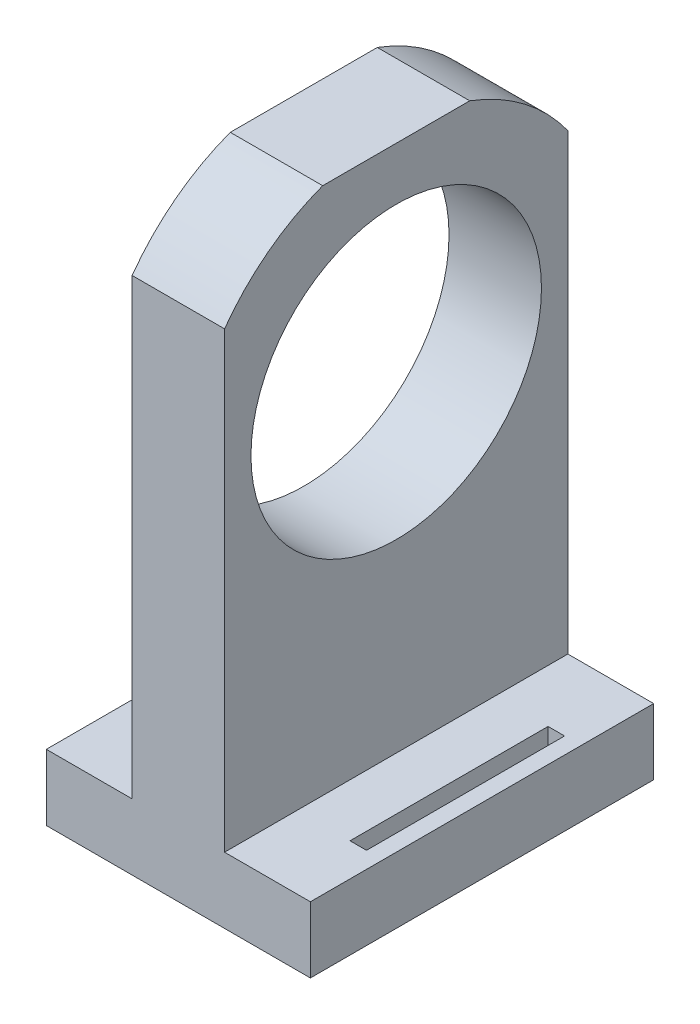
ISO-10303-21;
HEADER;
FILE_DESCRIPTION(('STEP AP214'),'2;1');
FILE_NAME('part.step','',(''),(''),'','','');
FILE_SCHEMA(('AUTOMOTIVE_DESIGN { 1 0 10303 214 1 1 1 1 }'));
ENDSEC;
DATA;
#1=APPLICATION_CONTEXT('core data for automotive mechanical design processes');
#2=APPLICATION_PROTOCOL_DEFINITION('international standard','automotive_design',2000,#1);
#3=PRODUCT_CONTEXT('',#1,'mechanical');
#4=PRODUCT('Part','Part','',(#3));
#5=PRODUCT_RELATED_PRODUCT_CATEGORY('part','',(#4));
#6=PRODUCT_DEFINITION_FORMATION('','',#4);
#7=PRODUCT_DEFINITION_CONTEXT('part definition',#1,'design');
#8=PRODUCT_DEFINITION('design','',#6,#7);
#9=PRODUCT_DEFINITION_SHAPE('','',#8);
#10=(LENGTH_UNIT() NAMED_UNIT(*) SI_UNIT(.MILLI.,.METRE.));
#11=(NAMED_UNIT(*) PLANE_ANGLE_UNIT() SI_UNIT($,.RADIAN.));
#12=(NAMED_UNIT(*) SI_UNIT($,.STERADIAN.) SOLID_ANGLE_UNIT());
#13=UNCERTAINTY_MEASURE_WITH_UNIT(LENGTH_MEASURE(1.E-05),#10,'distance_accuracy_value','');
#14=(GEOMETRIC_REPRESENTATION_CONTEXT(3) GLOBAL_UNCERTAINTY_ASSIGNED_CONTEXT((#13)) GLOBAL_UNIT_ASSIGNED_CONTEXT((#10,
#11,#12)) REPRESENTATION_CONTEXT('',''));
#15=CARTESIAN_POINT('',(0.,0.,0.));
#16=DIRECTION('',(0.,0.,1.));
#17=DIRECTION('',(1.,0.,0.));
#18=AXIS2_PLACEMENT_3D('',#15,#16,#17);
#19=CARTESIAN_POINT('',(0.,5.,0.));
#20=DIRECTION('',(0.,1.,0.));
#21=DIRECTION('',(0.,0.,1.));
#22=AXIS2_PLACEMENT_3D('',#19,#20,#21);
#23=PLANE('',#22);
#24=DIRECTION('',(0.,0.,-1.));
#25=VECTOR('',#24,1.);
#26=CARTESIAN_POINT('',(13.5,5.,0.));
#27=LINE('',#26,#25);
#28=CARTESIAN_POINT('',(13.5,5.,0.));
#29=VERTEX_POINT('',#28);
#30=CARTESIAN_POINT('',(13.5,5.,-26.));
#31=VERTEX_POINT('',#30);
#32=EDGE_CURVE('E205',#29,#31,#27,.T.);
#33=ORIENTED_EDGE('',*,*,#32,.F.);
#34=DIRECTION('',(1.,0.,0.));
#35=VECTOR('',#34,1.);
#36=CARTESIAN_POINT('',(0.,5.,0.));
#37=LINE('',#36,#35);
#38=CARTESIAN_POINT('',(20.,5.,0.));
#39=VERTEX_POINT('',#38);
#40=EDGE_CURVE('E252',#29,#39,#37,.T.);
#41=ORIENTED_EDGE('',*,*,#40,.T.);
#42=DIRECTION('',(0.,0.,1.));
#43=VECTOR('',#42,1.);
#44=CARTESIAN_POINT('',(20.,5.,0.));
#45=LINE('',#44,#43);
#46=CARTESIAN_POINT('',(20.,5.,-26.));
#47=VERTEX_POINT('',#46);
#48=EDGE_CURVE('E239',#47,#39,#45,.T.);
#49=ORIENTED_EDGE('',*,*,#48,.F.);
#50=DIRECTION('',(1.,0.,0.));
#51=VECTOR('',#50,1.);
#52=CARTESIAN_POINT('',(0.,5.,-26.));
#53=LINE('',#52,#51);
#54=EDGE_CURVE('E243',#31,#47,#53,.T.);
#55=ORIENTED_EDGE('',*,*,#54,.F.);
#56=EDGE_LOOP('',(#33,#41,#49,#55));
#57=FACE_BOUND('',#56,.T.);
#58=DIRECTION('',(1.,0.,0.));
#59=VECTOR('',#58,1.);
#60=CARTESIAN_POINT('',(0.,5.,-5.49999999999998));
#61=LINE('',#60,#59);
#62=CARTESIAN_POINT('',(17.5007845324833,5.,-5.49999999999998));
#63=VERTEX_POINT('',#62);
#64=CARTESIAN_POINT('',(18.7507845324833,5.,-5.49999999999998));
#65=VERTEX_POINT('',#64);
#66=EDGE_CURVE('E224',#63,#65,#61,.T.);
#67=ORIENTED_EDGE('',*,*,#66,.F.);
#68=DIRECTION('',(0.,0.,1.));
#69=VECTOR('',#68,1.);
#70=CARTESIAN_POINT('',(17.5007845324833,5.,0.));
#71=LINE('',#70,#69);
#72=CARTESIAN_POINT('',(17.5007845324833,5.,-20.5));
#73=VERTEX_POINT('',#72);
#74=EDGE_CURVE('E228',#73,#63,#71,.T.);
#75=ORIENTED_EDGE('',*,*,#74,.F.);
#76=DIRECTION('',(1.,0.,0.));
#77=VECTOR('',#76,1.);
#78=CARTESIAN_POINT('',(-1.13797860024078E-13,5.,-20.4999999999999));
#79=LINE('',#78,#77);
#80=CARTESIAN_POINT('',(18.7507845324833,5.,-20.5));
#81=VERTEX_POINT('',#80);
#82=EDGE_CURVE('E233',#73,#81,#79,.T.);
#83=ORIENTED_EDGE('',*,*,#82,.T.);
#84=DIRECTION('',(0.,0.,1.));
#85=VECTOR('',#84,1.);
#86=CARTESIAN_POINT('',(18.7507845324833,5.,0.));
#87=LINE('',#86,#85);
#88=EDGE_CURVE('E236',#81,#65,#87,.T.);
#89=ORIENTED_EDGE('',*,*,#88,.T.);
#90=EDGE_LOOP('',(#67,#75,#83,#89));
#91=FACE_BOUND('',#90,.T.);
#92=ADVANCED_FACE('F47',(#57,#91),#23,.T.);
#93=CARTESIAN_POINT('',(2.5,5.,0.));
#94=DIRECTION('',(1.,0.,0.));
#95=DIRECTION('',(0.,0.,-1.));
#96=AXIS2_PLACEMENT_3D('',#93,#94,#95);
#97=PLANE('',#96);
#98=DIRECTION('',(0.,0.,1.));
#99=VECTOR('',#98,1.);
#100=CARTESIAN_POINT('',(2.5,0.,0.));
#101=LINE('',#100,#99);
#102=CARTESIAN_POINT('',(2.5,0.,-20.5));
#103=VERTEX_POINT('',#102);
#104=CARTESIAN_POINT('',(2.5,0.,-5.49999999999998));
#105=VERTEX_POINT('',#104);
#106=EDGE_CURVE('E303',#103,#105,#101,.T.);
#107=ORIENTED_EDGE('',*,*,#106,.T.);
#108=DIRECTION('',(0.,-1.,0.));
#109=VECTOR('',#108,1.);
#110=CARTESIAN_POINT('',(2.5,5.,-5.49999999999998));
#111=LINE('',#110,#109);
#112=CARTESIAN_POINT('',(2.5,5.,-5.49999999999998));
#113=VERTEX_POINT('',#112);
#114=EDGE_CURVE('E11',#113,#105,#111,.T.);
#115=ORIENTED_EDGE('',*,*,#114,.F.);
#116=DIRECTION('',(0.,0.,1.));
#117=VECTOR('',#116,1.);
#118=CARTESIAN_POINT('',(2.5,5.,0.));
#119=LINE('',#118,#117);
#120=CARTESIAN_POINT('',(2.5,5.,-20.5));
#121=VERTEX_POINT('',#120);
#122=EDGE_CURVE('E257',#121,#113,#119,.T.);
#123=ORIENTED_EDGE('',*,*,#122,.F.);
#124=DIRECTION('',(0.,-1.,0.));
#125=VECTOR('',#124,1.);
#126=CARTESIAN_POINT('',(2.5,5.,-20.5));
#127=LINE('',#126,#125);
#128=EDGE_CURVE('E318',#121,#103,#127,.T.);
#129=ORIENTED_EDGE('',*,*,#128,.T.);
#130=EDGE_LOOP('',(#107,#115,#123,#129));
#131=FACE_BOUND('',#130,.T.);
#132=ADVANCED_FACE('F368',(#131),#97,.F.);
#133=CARTESIAN_POINT('',(0.,5.,-5.49999999999998));
#134=DIRECTION('',(0.,0.,1.));
#135=DIRECTION('',(1.,0.,0.));
#136=AXIS2_PLACEMENT_3D('',#133,#134,#135);
#137=PLANE('',#136);
#138=DIRECTION('',(-1.,0.,0.));
#139=VECTOR('',#138,1.);
#140=CARTESIAN_POINT('',(0.,0.,-5.49999999999998));
#141=LINE('',#140,#139);
#142=CARTESIAN_POINT('',(1.25,0.,-5.49999999999998));
#143=VERTEX_POINT('',#142);
#144=EDGE_CURVE('E307',#105,#143,#141,.T.);
#145=ORIENTED_EDGE('',*,*,#144,.T.);
#146=DIRECTION('',(0.,-1.,0.));
#147=VECTOR('',#146,1.);
#148=CARTESIAN_POINT('',(1.25,5.,-5.49999999999998));
#149=LINE('',#148,#147);
#150=CARTESIAN_POINT('',(1.25,5.,-5.49999999999998));
#151=VERTEX_POINT('',#150);
#152=EDGE_CURVE('E57',#151,#143,#149,.T.);
#153=ORIENTED_EDGE('',*,*,#152,.F.);
#154=DIRECTION('',(-1.,0.,0.));
#155=VECTOR('',#154,1.);
#156=CARTESIAN_POINT('',(0.,5.,-5.49999999999998));
#157=LINE('',#156,#155);
#158=EDGE_CURVE('E261',#113,#151,#157,.T.);
#159=ORIENTED_EDGE('',*,*,#158,.F.);
#160=ORIENTED_EDGE('',*,*,#114,.T.);
#161=EDGE_LOOP('',(#145,#153,#159,#160));
#162=FACE_BOUND('',#161,.T.);
#163=ADVANCED_FACE('F377',(#162),#137,.F.);
#164=CARTESIAN_POINT('',(1.25,5.,0.));
#165=DIRECTION('',(1.,0.,0.));
#166=DIRECTION('',(0.,0.,-1.));
#167=AXIS2_PLACEMENT_3D('',#164,#165,#166);
#168=PLANE('',#167);
#169=DIRECTION('',(0.,0.,1.));
#170=VECTOR('',#169,1.);
#171=CARTESIAN_POINT('',(1.25,0.,0.));
#172=LINE('',#171,#170);
#173=CARTESIAN_POINT('',(1.25,0.,-20.5));
#174=VERTEX_POINT('',#173);
#175=EDGE_CURVE('E311',#174,#143,#172,.T.);
#176=ORIENTED_EDGE('',*,*,#175,.F.);
#177=DIRECTION('',(0.,-1.,0.));
#178=VECTOR('',#177,1.);
#179=CARTESIAN_POINT('',(1.25,5.,-20.5));
#180=LINE('',#179,#178);
#181=CARTESIAN_POINT('',(1.25,5.,-20.5));
#182=VERTEX_POINT('',#181);
#183=EDGE_CURVE('E321',#182,#174,#180,.T.);
#184=ORIENTED_EDGE('',*,*,#183,.F.);
#185=DIRECTION('',(0.,0.,1.));
#186=VECTOR('',#185,1.);
#187=CARTESIAN_POINT('',(1.25,5.,0.));
#188=LINE('',#187,#186);
#189=EDGE_CURVE('E264',#182,#151,#188,.T.);
#190=ORIENTED_EDGE('',*,*,#189,.T.);
#191=ORIENTED_EDGE('',*,*,#152,.T.);
#192=EDGE_LOOP('',(#176,#184,#190,#191));
#193=FACE_BOUND('',#192,.T.);
#194=ADVANCED_FACE('F403',(#193),#168,.T.);
#195=CARTESIAN_POINT('',(20.,5.,0.));
#196=DIRECTION('',(1.,0.,0.));
#197=DIRECTION('',(0.,0.,-1.));
#198=AXIS2_PLACEMENT_3D('',#195,#196,#197);
#199=PLANE('',#198);
#200=DIRECTION('',(0.,0.,1.));
#201=VECTOR('',#200,1.);
#202=CARTESIAN_POINT('',(20.,0.,0.));
#203=LINE('',#202,#201);
#204=CARTESIAN_POINT('',(20.,0.,-26.));
#205=VERTEX_POINT('',#204);
#206=CARTESIAN_POINT('',(20.,0.,0.));
#207=VERTEX_POINT('',#206);
#208=EDGE_CURVE('E287',#205,#207,#203,.T.);
#209=ORIENTED_EDGE('',*,*,#208,.F.);
#210=DIRECTION('',(0.,-1.,0.));
#211=VECTOR('',#210,1.);
#212=CARTESIAN_POINT('',(20.,5.,-26.));
#213=LINE('',#212,#211);
#214=EDGE_CURVE('E322',#47,#205,#213,.T.);
#215=ORIENTED_EDGE('',*,*,#214,.F.);
#216=ORIENTED_EDGE('',*,*,#48,.T.);
#217=DIRECTION('',(0.,-1.,0.));
#218=VECTOR('',#217,1.);
#219=CARTESIAN_POINT('',(20.,5.,0.));
#220=LINE('',#219,#218);
#221=EDGE_CURVE('E327',#39,#207,#220,.T.);
#222=ORIENTED_EDGE('',*,*,#221,.T.);
#223=EDGE_LOOP('',(#209,#215,#216,#222));
#224=FACE_BOUND('',#223,.T.);
#225=ADVANCED_FACE('F407',(#224),#199,.T.);
#226=CARTESIAN_POINT('',(0.,5.,-26.));
#227=DIRECTION('',(0.,0.,-1.));
#228=DIRECTION('',(-1.,0.,0.));
#229=AXIS2_PLACEMENT_3D('',#226,#227,#228);
#230=PLANE('',#229);
#231=DIRECTION('',(1.,0.,0.));
#232=VECTOR('',#231,1.);
#233=CARTESIAN_POINT('',(-0.000999999999999265,39.3273790530888,-26.));
#234=LINE('',#233,#232);
#235=CARTESIAN_POINT('',(6.5,39.3273790530888,-26.));
#236=VERTEX_POINT('',#235);
#237=CARTESIAN_POINT('',(13.5,39.3273790530888,-26.));
#238=VERTEX_POINT('',#237);
#239=EDGE_CURVE('E182',#236,#238,#234,.T.);
#240=ORIENTED_EDGE('',*,*,#239,.T.);
#241=DIRECTION('',(0.,-1.,0.));
#242=VECTOR('',#241,1.);
#243=CARTESIAN_POINT('',(13.5,45.,-26.));
#244=LINE('',#243,#242);
#245=EDGE_CURVE('E191',#238,#31,#244,.T.);
#246=ORIENTED_EDGE('',*,*,#245,.T.);
#247=ORIENTED_EDGE('',*,*,#54,.T.);
#248=ORIENTED_EDGE('',*,*,#214,.T.);
#249=DIRECTION('',(1.,0.,0.));
#250=VECTOR('',#249,1.);
#251=CARTESIAN_POINT('',(0.,0.,-26.));
#252=LINE('',#251,#250);
#253=CARTESIAN_POINT('',(0.,0.,-26.));
#254=VERTEX_POINT('',#253);
#255=EDGE_CURVE('E291',#254,#205,#252,.T.);
#256=ORIENTED_EDGE('',*,*,#255,.F.);
#257=DIRECTION('',(0.,-1.,0.));
#258=VECTOR('',#257,1.);
#259=CARTESIAN_POINT('',(0.,5.,-26.));
#260=LINE('',#259,#258);
#261=CARTESIAN_POINT('',(0.,5.,-26.));
#262=VERTEX_POINT('',#261);
#263=EDGE_CURVE('E333',#262,#254,#260,.T.);
#264=ORIENTED_EDGE('',*,*,#263,.F.);
#265=CARTESIAN_POINT('',(6.5,5.,-26.));
#266=VERTEX_POINT('',#265);
#267=EDGE_CURVE('E244',#262,#266,#53,.T.);
#268=ORIENTED_EDGE('',*,*,#267,.T.);
#269=DIRECTION('',(0.,-1.,0.));
#270=VECTOR('',#269,1.);
#271=CARTESIAN_POINT('',(6.5,45.,-26.));
#272=LINE('',#271,#270);
#273=EDGE_CURVE('E218',#236,#266,#272,.T.);
#274=ORIENTED_EDGE('',*,*,#273,.F.);
#275=EDGE_LOOP('',(#240,#246,#247,#248,#256,#264,#268,#274));
#276=FACE_BOUND('',#275,.T.);
#277=ADVANCED_FACE('F413',(#276),#230,.T.);
#278=CARTESIAN_POINT('',(0.,5.,0.));
#279=DIRECTION('',(-1.,0.,0.));
#280=DIRECTION('',(0.,0.,1.));
#281=AXIS2_PLACEMENT_3D('',#278,#279,#280);
#282=PLANE('',#281);
#283=DIRECTION('',(0.,0.,-1.));
#284=VECTOR('',#283,1.);
#285=CARTESIAN_POINT('',(0.,0.,0.));
#286=LINE('',#285,#284);
#287=CARTESIAN_POINT('',(0.,0.,0.));
#288=VERTEX_POINT('',#287);
#289=EDGE_CURVE('E295',#288,#254,#286,.T.);
#290=ORIENTED_EDGE('',*,*,#289,.F.);
#291=DIRECTION('',(0.,-1.,0.));
#292=VECTOR('',#291,1.);
#293=CARTESIAN_POINT('',(0.,5.,0.));
#294=LINE('',#293,#292);
#295=CARTESIAN_POINT('',(0.,5.,0.));
#296=VERTEX_POINT('',#295);
#297=EDGE_CURVE('E330',#296,#288,#294,.T.);
#298=ORIENTED_EDGE('',*,*,#297,.F.);
#299=DIRECTION('',(0.,0.,-1.));
#300=VECTOR('',#299,1.);
#301=CARTESIAN_POINT('',(0.,5.,0.));
#302=LINE('',#301,#300);
#303=EDGE_CURVE('E248',#296,#262,#302,.T.);
#304=ORIENTED_EDGE('',*,*,#303,.T.);
#305=ORIENTED_EDGE('',*,*,#263,.T.);
#306=EDGE_LOOP('',(#290,#298,#304,#305));
#307=FACE_BOUND('',#306,.T.);
#308=ADVANCED_FACE('F422',(#307),#282,.T.);
#309=CARTESIAN_POINT('',(0.,5.,-5.49999999999998));
#310=DIRECTION('',(0.,0.,-1.));
#311=DIRECTION('',(-1.,0.,0.));
#312=AXIS2_PLACEMENT_3D('',#309,#310,#311);
#313=PLANE('',#312);
#314=DIRECTION('',(1.,0.,0.));
#315=VECTOR('',#314,1.);
#316=CARTESIAN_POINT('',(0.,0.,-5.49999999999998));
#317=LINE('',#316,#315);
#318=CARTESIAN_POINT('',(17.5007845324833,0.,-5.49999999999998));
#319=VERTEX_POINT('',#318);
#320=CARTESIAN_POINT('',(18.7507845324833,0.,-5.49999999999998));
#321=VERTEX_POINT('',#320);
#322=EDGE_CURVE('E223',#319,#321,#317,.T.);
#323=ORIENTED_EDGE('',*,*,#322,.F.);
#324=DIRECTION('',(0.,-1.,0.));
#325=VECTOR('',#324,1.);
#326=CARTESIAN_POINT('',(17.5007845324833,5.,-5.49999999999998));
#327=LINE('',#326,#325);
#328=EDGE_CURVE('E51',#63,#319,#327,.T.);
#329=ORIENTED_EDGE('',*,*,#328,.F.);
#330=ORIENTED_EDGE('',*,*,#66,.T.);
#331=DIRECTION('',(0.,-1.,0.));
#332=VECTOR('',#331,1.);
#333=CARTESIAN_POINT('',(18.7507845324833,5.,-5.49999999999998));
#334=LINE('',#333,#332);
#335=EDGE_CURVE('E272',#65,#321,#334,.T.);
#336=ORIENTED_EDGE('',*,*,#335,.T.);
#337=EDGE_LOOP('',(#323,#329,#330,#336));
#338=FACE_BOUND('',#337,.T.);
#339=ADVANCED_FACE('F49',(#338),#313,.T.);
#340=CARTESIAN_POINT('',(17.5007845324833,5.,0.));
#341=DIRECTION('',(1.,0.,0.));
#342=DIRECTION('',(0.,0.,-1.));
#343=AXIS2_PLACEMENT_3D('',#340,#341,#342);
#344=PLANE('',#343);
#345=DIRECTION('',(0.,0.,1.));
#346=VECTOR('',#345,1.);
#347=CARTESIAN_POINT('',(17.5007845324833,0.,0.));
#348=LINE('',#347,#346);
#349=CARTESIAN_POINT('',(17.5007845324833,0.,-20.5));
#350=VERTEX_POINT('',#349);
#351=EDGE_CURVE('E276',#350,#319,#348,.T.);
#352=ORIENTED_EDGE('',*,*,#351,.F.);
#353=DIRECTION('',(0.,-1.,0.));
#354=VECTOR('',#353,1.);
#355=CARTESIAN_POINT('',(17.5007845324833,5.,-20.5));
#356=LINE('',#355,#354);
#357=EDGE_CURVE('E343',#73,#350,#356,.T.);
#358=ORIENTED_EDGE('',*,*,#357,.F.);
#359=ORIENTED_EDGE('',*,*,#74,.T.);
#360=ORIENTED_EDGE('',*,*,#328,.T.);
#361=EDGE_LOOP('',(#352,#358,#359,#360));
#362=FACE_BOUND('',#361,.T.);
#363=ADVANCED_FACE('F352',(#362),#344,.T.);
#364=CARTESIAN_POINT('',(-1.13797860024078E-13,5.,-20.4999999999999));
#365=DIRECTION('',(0.,0.,-1.));
#366=DIRECTION('',(-1.,0.,0.));
#367=AXIS2_PLACEMENT_3D('',#364,#365,#366);
#368=PLANE('',#367);
#369=DIRECTION('',(1.,0.,0.));
#370=VECTOR('',#369,1.);
#371=CARTESIAN_POINT('',(-1.13797860024078E-13,0.,-20.4999999999999));
#372=LINE('',#371,#370);
#373=CARTESIAN_POINT('',(18.7507845324833,0.,-20.5));
#374=VERTEX_POINT('',#373);
#375=EDGE_CURVE('E280',#350,#374,#372,.T.);
#376=ORIENTED_EDGE('',*,*,#375,.T.);
#377=DIRECTION('',(0.,-1.,0.));
#378=VECTOR('',#377,1.);
#379=CARTESIAN_POINT('',(18.7507845324833,5.,-20.5));
#380=LINE('',#379,#378);
#381=EDGE_CURVE('E340',#81,#374,#380,.T.);
#382=ORIENTED_EDGE('',*,*,#381,.F.);
#383=ORIENTED_EDGE('',*,*,#82,.F.);
#384=ORIENTED_EDGE('',*,*,#357,.T.);
#385=EDGE_LOOP('',(#376,#382,#383,#384));
#386=FACE_BOUND('',#385,.T.);
#387=ADVANCED_FACE('F362',(#386),#368,.F.);
#388=CARTESIAN_POINT('',(0.,5.,0.));
#389=DIRECTION('',(0.,0.,-1.));
#390=DIRECTION('',(-1.,0.,0.));
#391=AXIS2_PLACEMENT_3D('',#388,#389,#390);
#392=PLANE('',#391);
#393=DIRECTION('',(0.,-1.,0.));
#394=VECTOR('',#393,1.);
#395=CARTESIAN_POINT('',(13.5,45.,0.));
#396=LINE('',#395,#394);
#397=CARTESIAN_POINT('',(13.5,39.3273790530888,0.));
#398=VERTEX_POINT('',#397);
#399=EDGE_CURVE('E202',#398,#29,#396,.T.);
#400=ORIENTED_EDGE('',*,*,#399,.F.);
#401=DIRECTION('',(1.,0.,0.));
#402=VECTOR('',#401,1.);
#403=CARTESIAN_POINT('',(-0.000999999999999265,39.3273790530888,0.));
#404=LINE('',#403,#402);
#405=CARTESIAN_POINT('',(6.5,39.3273790530888,0.));
#406=VERTEX_POINT('',#405);
#407=EDGE_CURVE('E558',#406,#398,#404,.T.);
#408=ORIENTED_EDGE('',*,*,#407,.F.);
#409=DIRECTION('',(0.,-1.,0.));
#410=VECTOR('',#409,1.);
#411=CARTESIAN_POINT('',(6.5,45.,0.));
#412=LINE('',#411,#410);
#413=CARTESIAN_POINT('',(6.5,5.,0.));
#414=VERTEX_POINT('',#413);
#415=EDGE_CURVE('E215',#406,#414,#412,.T.);
#416=ORIENTED_EDGE('',*,*,#415,.T.);
#417=EDGE_CURVE('E253',#296,#414,#37,.T.);
#418=ORIENTED_EDGE('',*,*,#417,.F.);
#419=ORIENTED_EDGE('',*,*,#297,.T.);
#420=DIRECTION('',(1.,0.,0.));
#421=VECTOR('',#420,1.);
#422=CARTESIAN_POINT('',(0.,0.,0.));
#423=LINE('',#422,#421);
#424=EDGE_CURVE('E299',#288,#207,#423,.T.);
#425=ORIENTED_EDGE('',*,*,#424,.T.);
#426=ORIENTED_EDGE('',*,*,#221,.F.);
#427=ORIENTED_EDGE('',*,*,#40,.F.);
#428=EDGE_LOOP('',(#400,#408,#416,#418,#419,#425,#426,#427));
#429=FACE_BOUND('',#428,.T.);
#430=ADVANCED_FACE('F418',(#429),#392,.F.);
#431=CARTESIAN_POINT('',(18.7507845324833,5.,0.));
#432=DIRECTION('',(1.,0.,0.));
#433=DIRECTION('',(0.,0.,-1.));
#434=AXIS2_PLACEMENT_3D('',#431,#432,#433);
#435=PLANE('',#434);
#436=DIRECTION('',(0.,0.,1.));
#437=VECTOR('',#436,1.);
#438=CARTESIAN_POINT('',(18.7507845324833,0.,0.));
#439=LINE('',#438,#437);
#440=EDGE_CURVE('E283',#374,#321,#439,.T.);
#441=ORIENTED_EDGE('',*,*,#440,.T.);
#442=ORIENTED_EDGE('',*,*,#335,.F.);
#443=ORIENTED_EDGE('',*,*,#88,.F.);
#444=ORIENTED_EDGE('',*,*,#381,.T.);
#445=EDGE_LOOP('',(#441,#442,#443,#444));
#446=FACE_BOUND('',#445,.T.);
#447=ADVANCED_FACE('F365',(#446),#435,.F.);
#448=CARTESIAN_POINT('',(0.,5.,-20.5));
#449=DIRECTION('',(0.,0.,1.));
#450=DIRECTION('',(1.,0.,0.));
#451=AXIS2_PLACEMENT_3D('',#448,#449,#450);
#452=PLANE('',#451);
#453=DIRECTION('',(-1.,0.,0.));
#454=VECTOR('',#453,1.);
#455=CARTESIAN_POINT('',(0.,0.,-20.5));
#456=LINE('',#455,#454);
#457=EDGE_CURVE('E229',#103,#174,#456,.T.);
#458=ORIENTED_EDGE('',*,*,#457,.F.);
#459=ORIENTED_EDGE('',*,*,#128,.F.);
#460=DIRECTION('',(-1.,0.,0.));
#461=VECTOR('',#460,1.);
#462=CARTESIAN_POINT('',(0.,5.,-20.5));
#463=LINE('',#462,#461);
#464=EDGE_CURVE('E268',#121,#182,#463,.T.);
#465=ORIENTED_EDGE('',*,*,#464,.T.);
#466=ORIENTED_EDGE('',*,*,#183,.T.);
#467=EDGE_LOOP('',(#458,#459,#465,#466));
#468=FACE_BOUND('',#467,.T.);
#469=ADVANCED_FACE('F383',(#468),#452,.T.);
#470=DIRECTION('',(0.,0.,1.));
#471=VECTOR('',#470,1.);
#472=CARTESIAN_POINT('',(6.5,5.,0.));
#473=LINE('',#472,#471);
#474=EDGE_CURVE('E198',#266,#414,#473,.T.);
#475=ORIENTED_EDGE('',*,*,#474,.F.);
#476=ORIENTED_EDGE('',*,*,#267,.F.);
#477=ORIENTED_EDGE('',*,*,#303,.F.);
#478=ORIENTED_EDGE('',*,*,#417,.T.);
#479=EDGE_LOOP('',(#475,#476,#477,#478));
#480=FACE_BOUND('',#479,.T.);
#481=ORIENTED_EDGE('',*,*,#122,.T.);
#482=ORIENTED_EDGE('',*,*,#158,.T.);
#483=ORIENTED_EDGE('',*,*,#189,.F.);
#484=ORIENTED_EDGE('',*,*,#464,.F.);
#485=EDGE_LOOP('',(#481,#482,#483,#484));
#486=FACE_BOUND('',#485,.T.);
#487=ADVANCED_FACE('F371',(#480,#486),#23,.T.);
#488=CARTESIAN_POINT('',(0.,0.,0.));
#489=DIRECTION('',(0.,1.,0.));
#490=DIRECTION('',(0.,0.,1.));
#491=AXIS2_PLACEMENT_3D('',#488,#489,#490);
#492=PLANE('',#491);
#493=ORIENTED_EDGE('',*,*,#322,.T.);
#494=ORIENTED_EDGE('',*,*,#440,.F.);
#495=ORIENTED_EDGE('',*,*,#375,.F.);
#496=ORIENTED_EDGE('',*,*,#351,.T.);
#497=EDGE_LOOP('',(#493,#494,#495,#496));
#498=FACE_BOUND('',#497,.T.);
#499=ORIENTED_EDGE('',*,*,#208,.T.);
#500=ORIENTED_EDGE('',*,*,#424,.F.);
#501=ORIENTED_EDGE('',*,*,#289,.T.);
#502=ORIENTED_EDGE('',*,*,#255,.T.);
#503=EDGE_LOOP('',(#499,#500,#501,#502));
#504=FACE_BOUND('',#503,.T.);
#505=ORIENTED_EDGE('',*,*,#106,.F.);
#506=ORIENTED_EDGE('',*,*,#457,.T.);
#507=ORIENTED_EDGE('',*,*,#175,.T.);
#508=ORIENTED_EDGE('',*,*,#144,.F.);
#509=EDGE_LOOP('',(#505,#506,#507,#508));
#510=FACE_BOUND('',#509,.T.);
#511=ADVANCED_FACE('F359',(#498,#504,#510),#492,.F.);
#512=CARTESIAN_POINT('',(13.5,45.,0.));
#513=DIRECTION('',(-1.,0.,0.));
#514=DIRECTION('',(0.,0.,1.));
#515=AXIS2_PLACEMENT_3D('',#512,#513,#514);
#516=PLANE('',#515);
#517=CARTESIAN_POINT('',(13.5,30.,-13.));
#518=DIRECTION('',(1.,0.,0.));
#519=DIRECTION('',(0.,0.,-1.));
#520=AXIS2_PLACEMENT_3D('',#517,#518,#519);
#521=CIRCLE('',#520,11.);
#522=CARTESIAN_POINT('',(13.5,30.,-24.));
#523=VERTEX_POINT('',#522);
#524=EDGE_CURVE('E546',#523,#523,#521,.T.);
#525=ORIENTED_EDGE('',*,*,#524,.F.);
#526=EDGE_LOOP('',(#525));
#527=FACE_BOUND('',#526,.T.);
#528=DIRECTION('',(0.,0.,-1.));
#529=VECTOR('',#528,1.);
#530=CARTESIAN_POINT('',(13.5,45.,0.));
#531=LINE('',#530,#529);
#532=CARTESIAN_POINT('',(13.5,45.,-7.43223563716997));
#533=VERTEX_POINT('',#532);
#534=CARTESIAN_POINT('',(13.5,45.,-18.56776436283));
#535=VERTEX_POINT('',#534);
#536=EDGE_CURVE('E189',#533,#535,#531,.T.);
#537=ORIENTED_EDGE('',*,*,#536,.F.);
#538=CARTESIAN_POINT('',(13.5,30.,-13.));
#539=DIRECTION('',(-1.,0.,0.));
#540=DIRECTION('',(0.,0.,-1.));
#541=AXIS2_PLACEMENT_3D('',#538,#539,#540);
#542=CIRCLE('',#541,16.);
#543=EDGE_CURVE('E73',#398,#533,#542,.T.);
#544=ORIENTED_EDGE('',*,*,#543,.F.);
#545=ORIENTED_EDGE('',*,*,#399,.T.);
#546=ORIENTED_EDGE('',*,*,#32,.T.);
#547=ORIENTED_EDGE('',*,*,#245,.F.);
#548=CARTESIAN_POINT('',(13.5,30.,-13.));
#549=DIRECTION('',(-1.,0.,0.));
#550=DIRECTION('',(0.,0.,-1.));
#551=AXIS2_PLACEMENT_3D('',#548,#549,#550);
#552=CIRCLE('',#551,16.);
#553=EDGE_CURVE('E175',#535,#238,#552,.T.);
#554=ORIENTED_EDGE('',*,*,#553,.F.);
#555=EDGE_LOOP('',(#537,#544,#545,#546,#547,#554));
#556=FACE_BOUND('',#555,.T.);
#557=ADVANCED_FACE('F188',(#527,#556),#516,.F.);
#558=CARTESIAN_POINT('',(6.5,45.,0.));
#559=DIRECTION('',(1.,0.,0.));
#560=DIRECTION('',(0.,0.,-1.));
#561=AXIS2_PLACEMENT_3D('',#558,#559,#560);
#562=PLANE('',#561);
#563=CARTESIAN_POINT('',(6.5,30.,-13.));
#564=DIRECTION('',(1.,0.,0.));
#565=DIRECTION('',(0.,0.,-1.));
#566=AXIS2_PLACEMENT_3D('',#563,#564,#565);
#567=CIRCLE('',#566,11.);
#568=CARTESIAN_POINT('',(6.5,30.,-24.));
#569=VERTEX_POINT('',#568);
#570=EDGE_CURVE('E208',#569,#569,#567,.F.);
#571=ORIENTED_EDGE('',*,*,#570,.F.);
#572=EDGE_LOOP('',(#571));
#573=FACE_BOUND('',#572,.T.);
#574=ORIENTED_EDGE('',*,*,#415,.F.);
#575=CARTESIAN_POINT('',(6.5,30.,-13.));
#576=DIRECTION('',(1.,0.,0.));
#577=DIRECTION('',(0.,0.,-1.));
#578=AXIS2_PLACEMENT_3D('',#575,#576,#577);
#579=CIRCLE('',#578,16.);
#580=CARTESIAN_POINT('',(6.5,45.,-7.43223563716997));
#581=VERTEX_POINT('',#580);
#582=EDGE_CURVE('E183',#581,#406,#579,.T.);
#583=ORIENTED_EDGE('',*,*,#582,.F.);
#584=DIRECTION('',(0.,0.,1.));
#585=VECTOR('',#584,1.);
#586=CARTESIAN_POINT('',(6.5,45.,0.));
#587=LINE('',#586,#585);
#588=CARTESIAN_POINT('',(6.5,45.,-18.56776436283));
#589=VERTEX_POINT('',#588);
#590=EDGE_CURVE('E197',#589,#581,#587,.T.);
#591=ORIENTED_EDGE('',*,*,#590,.F.);
#592=CARTESIAN_POINT('',(6.5,30.,-13.));
#593=DIRECTION('',(1.,0.,0.));
#594=DIRECTION('',(0.,0.,-1.));
#595=AXIS2_PLACEMENT_3D('',#592,#593,#594);
#596=CIRCLE('',#595,16.);
#597=EDGE_CURVE('E65',#236,#589,#596,.T.);
#598=ORIENTED_EDGE('',*,*,#597,.F.);
#599=ORIENTED_EDGE('',*,*,#273,.T.);
#600=ORIENTED_EDGE('',*,*,#474,.T.);
#601=EDGE_LOOP('',(#574,#583,#591,#598,#599,#600));
#602=FACE_BOUND('',#601,.T.);
#603=ADVANCED_FACE('F496',(#573,#602),#562,.F.);
#604=CARTESIAN_POINT('',(0.,45.,0.));
#605=DIRECTION('',(0.,-1.,0.));
#606=DIRECTION('',(0.,0.,-1.));
#607=AXIS2_PLACEMENT_3D('',#604,#605,#606);
#608=PLANE('',#607);
#609=ORIENTED_EDGE('',*,*,#590,.T.);
#610=DIRECTION('',(1.,0.,0.));
#611=VECTOR('',#610,1.);
#612=CARTESIAN_POINT('',(-0.000999999999999265,45.,-7.43223563716997));
#613=LINE('',#612,#611);
#614=EDGE_CURVE('E195',#581,#533,#613,.T.);
#615=ORIENTED_EDGE('',*,*,#614,.T.);
#616=ORIENTED_EDGE('',*,*,#536,.T.);
#617=DIRECTION('',(1.,0.,0.));
#618=VECTOR('',#617,1.);
#619=CARTESIAN_POINT('',(-0.000999999999999265,45.,-18.56776436283));
#620=LINE('',#619,#618);
#621=EDGE_CURVE('E172',#589,#535,#620,.T.);
#622=ORIENTED_EDGE('',*,*,#621,.F.);
#623=EDGE_LOOP('',(#609,#615,#616,#622));
#624=FACE_BOUND('',#623,.T.);
#625=ADVANCED_FACE('F194',(#624),#608,.F.);
#626=CARTESIAN_POINT('',(-0.000999999999999265,30.,-13.));
#627=DIRECTION('',(1.,0.,0.));
#628=DIRECTION('',(0.,0.,-1.));
#629=AXIS2_PLACEMENT_3D('',#626,#627,#628);
#630=CYLINDRICAL_SURFACE('',#629,16.);
#631=ORIENTED_EDGE('',*,*,#597,.T.);
#632=ORIENTED_EDGE('',*,*,#621,.T.);
#633=ORIENTED_EDGE('',*,*,#553,.T.);
#634=ORIENTED_EDGE('',*,*,#239,.F.);
#635=EDGE_LOOP('',(#631,#632,#633,#634));
#636=FACE_BOUND('',#635,.T.);
#637=ADVANCED_FACE('F174',(#636),#630,.T.);
#638=CARTESIAN_POINT('',(-0.000999999999999265,30.,-13.));
#639=DIRECTION('',(1.,0.,0.));
#640=DIRECTION('',(0.,0.,-1.));
#641=AXIS2_PLACEMENT_3D('',#638,#639,#640);
#642=CYLINDRICAL_SURFACE('',#641,16.);
#643=ORIENTED_EDGE('',*,*,#582,.T.);
#644=ORIENTED_EDGE('',*,*,#407,.T.);
#645=ORIENTED_EDGE('',*,*,#543,.T.);
#646=ORIENTED_EDGE('',*,*,#614,.F.);
#647=EDGE_LOOP('',(#643,#644,#645,#646));
#648=FACE_BOUND('',#647,.T.);
#649=ADVANCED_FACE('F522',(#648),#642,.T.);
#650=CARTESIAN_POINT('',(-0.000999999999999265,30.,-13.));
#651=DIRECTION('',(1.,0.,0.));
#652=DIRECTION('',(0.,0.,-1.));
#653=AXIS2_PLACEMENT_3D('',#650,#651,#652);
#654=CYLINDRICAL_SURFACE('',#653,11.);
#655=CARTESIAN_POINT('',(13.5,30.,-24.));
#656=CARTESIAN_POINT('',(13.4270833333333,30.,-24.));
#657=CARTESIAN_POINT('',(13.3541666666667,30.,-24.));
#658=CARTESIAN_POINT('',(13.2083333333333,30.,-24.));
#659=CARTESIAN_POINT('',(13.1354166666667,30.,-24.));
#660=CARTESIAN_POINT('',(12.9895833333333,30.,-24.));
#661=CARTESIAN_POINT('',(12.9166666666667,30.,-24.));
#662=CARTESIAN_POINT('',(12.7708333333333,30.,-24.));
#663=CARTESIAN_POINT('',(12.6979166666667,30.,-24.));
#664=CARTESIAN_POINT('',(12.5520833333333,30.,-24.));
#665=CARTESIAN_POINT('',(12.4791666666667,30.,-24.));
#666=CARTESIAN_POINT('',(12.3333333333333,30.,-24.));
#667=CARTESIAN_POINT('',(12.2604166666667,30.,-24.));
#668=CARTESIAN_POINT('',(12.1145833333333,30.,-24.));
#669=CARTESIAN_POINT('',(12.0416666666667,30.,-24.));
#670=CARTESIAN_POINT('',(11.8958333333333,30.,-24.));
#671=CARTESIAN_POINT('',(11.8229166666667,30.,-24.));
#672=CARTESIAN_POINT('',(11.6770833333333,30.,-24.));
#673=CARTESIAN_POINT('',(11.6041666666667,30.,-24.));
#674=CARTESIAN_POINT('',(11.4583333333333,30.,-24.));
#675=CARTESIAN_POINT('',(11.3854166666667,30.,-24.));
#676=CARTESIAN_POINT('',(11.2395833333333,30.,-24.));
#677=CARTESIAN_POINT('',(11.1666666666667,30.,-24.));
#678=CARTESIAN_POINT('',(11.0208333333333,30.,-24.));
#679=CARTESIAN_POINT('',(10.9479166666667,30.,-24.));
#680=CARTESIAN_POINT('',(10.8020833333333,30.,-24.));
#681=CARTESIAN_POINT('',(10.7291666666667,30.,-24.));
#682=CARTESIAN_POINT('',(10.5833333333333,30.,-24.));
#683=CARTESIAN_POINT('',(10.5104166666667,30.,-24.));
#684=CARTESIAN_POINT('',(10.3645833333333,30.,-24.));
#685=CARTESIAN_POINT('',(10.2916666666667,30.,-24.));
#686=CARTESIAN_POINT('',(10.1458333333333,30.,-24.));
#687=CARTESIAN_POINT('',(10.0729166666667,30.,-24.));
#688=CARTESIAN_POINT('',(9.92708333333333,30.,-24.));
#689=CARTESIAN_POINT('',(9.85416666666667,30.,-24.));
#690=CARTESIAN_POINT('',(9.70833333333333,30.,-24.));
#691=CARTESIAN_POINT('',(9.63541666666667,30.,-24.));
#692=CARTESIAN_POINT('',(9.48958333333333,30.,-24.));
#693=CARTESIAN_POINT('',(9.41666666666667,30.,-24.));
#694=CARTESIAN_POINT('',(9.27083333333333,30.,-24.));
#695=CARTESIAN_POINT('',(9.19791666666666,30.,-24.));
#696=CARTESIAN_POINT('',(9.05208333333333,30.,-24.));
#697=CARTESIAN_POINT('',(8.97916666666666,30.,-24.));
#698=CARTESIAN_POINT('',(8.83333333333333,30.,-24.));
#699=CARTESIAN_POINT('',(8.76041666666666,30.,-24.));
#700=CARTESIAN_POINT('',(8.61458333333333,30.,-24.));
#701=CARTESIAN_POINT('',(8.54166666666667,30.,-24.));
#702=CARTESIAN_POINT('',(8.39583333333333,30.,-24.));
#703=CARTESIAN_POINT('',(8.32291666666667,30.,-24.));
#704=CARTESIAN_POINT('',(8.17708333333333,30.,-24.));
#705=CARTESIAN_POINT('',(8.10416666666667,30.,-24.));
#706=CARTESIAN_POINT('',(7.95833333333333,30.,-24.));
#707=CARTESIAN_POINT('',(7.88541666666667,30.,-24.));
#708=CARTESIAN_POINT('',(7.73958333333333,30.,-24.));
#709=CARTESIAN_POINT('',(7.66666666666667,30.,-24.));
#710=CARTESIAN_POINT('',(7.52083333333333,30.,-24.));
#711=CARTESIAN_POINT('',(7.44791666666667,30.,-24.));
#712=CARTESIAN_POINT('',(7.30208333333333,30.,-24.));
#713=CARTESIAN_POINT('',(7.22916666666667,30.,-24.));
#714=CARTESIAN_POINT('',(7.08333333333333,30.,-24.));
#715=CARTESIAN_POINT('',(7.01041666666667,30.,-24.));
#716=CARTESIAN_POINT('',(6.86458333333333,30.,-24.));
#717=CARTESIAN_POINT('',(6.79166666666667,30.,-24.));
#718=CARTESIAN_POINT('',(6.64583333333333,30.,-24.));
#719=CARTESIAN_POINT('',(6.57291666666667,30.,-24.));
#720=CARTESIAN_POINT('',(6.5,30.,-24.));
#721=B_SPLINE_CURVE_WITH_KNOTS('',3,(#655,#656,#657,#658,#659,#660,#661,#662,#663,#664,#665,
#666,#667,#668,#669,#670,#671,#672,#673,#674,#675,#676,#677,#678,#679,#680,#681,#682,#683,#684,
#685,#686,#687,#688,#689,#690,#691,#692,#693,#694,#695,#696,#697,#698,#699,#700,#701,#702,#703,
#704,#705,#706,#707,#708,#709,#710,#711,#712,#713,#714,#715,#716,#717,#718,#719,#720),
.UNSPECIFIED.,.F.,.F.,(4,2,2,2,2,2,2,2,2,2,2,2,2,2,2,2,2,2,2,2,2,2,2,2,2,2,2,2,2,2,2,2,4),(0.,
0.21875,0.4375,0.656250000000001,0.875000000000001,1.09375,1.3125,1.53125,1.75,1.96875,2.1875,
2.40625,2.625,2.84375,3.0625,3.28125,3.5,3.71875,3.9375,4.15625,4.375,4.59375,4.8125,5.03125,
5.25,5.46875,5.6875,5.90625,6.125,6.34375,6.5625,6.78125,7.),.UNSPECIFIED.);
#722=EDGE_CURVE('BSEAM531',#523,#569,#721,.T.);
#723=ORIENTED_EDGE('',*,*,#524,.T.);
#724=ORIENTED_EDGE('',*,*,#570,.T.);
#725=ORIENTED_EDGE('',*,*,#722,.T.);
#726=ORIENTED_EDGE('',*,*,#722,.F.);
#727=EDGE_LOOP('',(#723,#725,#724,#726));
#728=FACE_BOUND('',#727,.T.);
#729=ADVANCED_FACE('F531',(#728),#654,.F.);
#730=CLOSED_SHELL('',(#92,#132,#163,#194,#225,#277,#308,#339,#363,#387,#430,#447,#469,#487,#511,
#557,#603,#625,#637,#649,#729));
#731=MANIFOLD_SOLID_BREP('B2',#730);
#732=ADVANCED_BREP_SHAPE_REPRESENTATION('',(#18,#731),#14);
#733=SHAPE_DEFINITION_REPRESENTATION(#9,#732);
ENDSEC;
END-ISO-10303-21;
